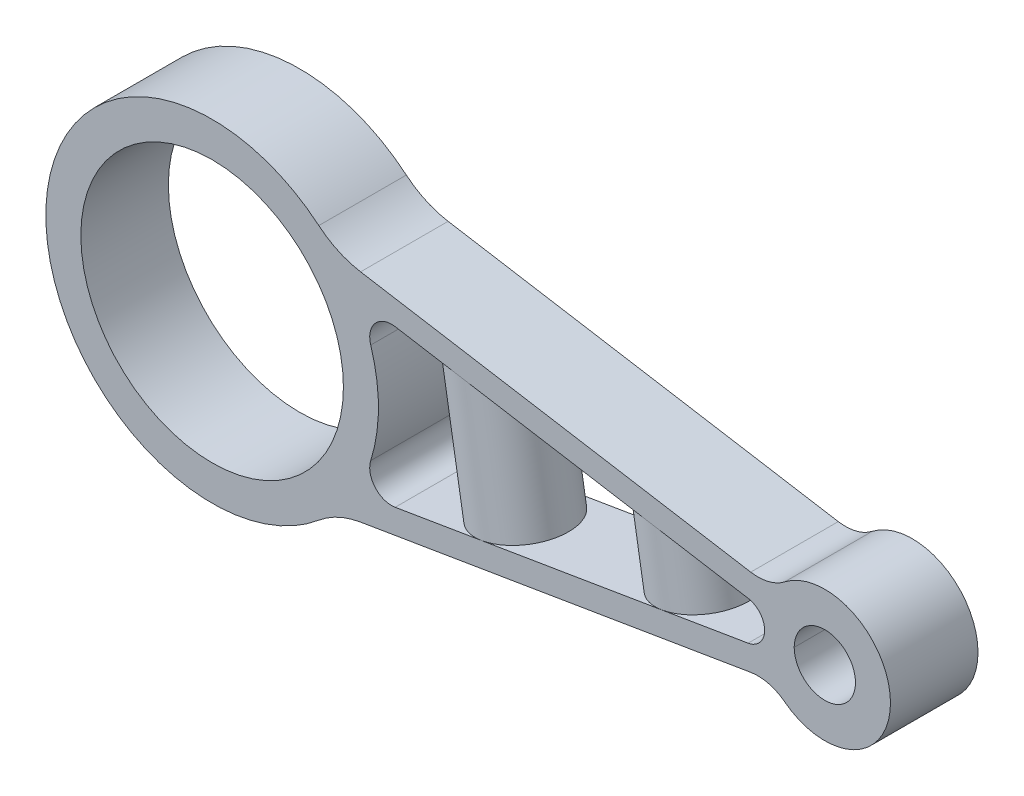
ISO-10303-21;
HEADER;
FILE_DESCRIPTION(('STEP AP214'),'2;1');
FILE_NAME('part.step','',(''),(''),'','','');
FILE_SCHEMA(('AUTOMOTIVE_DESIGN { 1 0 10303 214 1 1 1 1 }'));
ENDSEC;
DATA;
#1=APPLICATION_CONTEXT('core data for automotive mechanical design processes');
#2=APPLICATION_PROTOCOL_DEFINITION('international standard','automotive_design',2000,#1);
#3=PRODUCT_CONTEXT('',#1,'mechanical');
#4=PRODUCT('Part','Part','',(#3));
#5=PRODUCT_RELATED_PRODUCT_CATEGORY('part','',(#4));
#6=PRODUCT_DEFINITION_FORMATION('','',#4);
#7=PRODUCT_DEFINITION_CONTEXT('part definition',#1,'design');
#8=PRODUCT_DEFINITION('design','',#6,#7);
#9=PRODUCT_DEFINITION_SHAPE('','',#8);
#10=(LENGTH_UNIT() NAMED_UNIT(*) SI_UNIT(.MILLI.,.METRE.));
#11=(NAMED_UNIT(*) PLANE_ANGLE_UNIT() SI_UNIT($,.RADIAN.));
#12=(NAMED_UNIT(*) SI_UNIT($,.STERADIAN.) SOLID_ANGLE_UNIT());
#13=UNCERTAINTY_MEASURE_WITH_UNIT(LENGTH_MEASURE(1.E-05),#10,'distance_accuracy_value','');
#14=(GEOMETRIC_REPRESENTATION_CONTEXT(3) GLOBAL_UNCERTAINTY_ASSIGNED_CONTEXT((#13)) GLOBAL_UNIT_ASSIGNED_CONTEXT((#10,
#11,#12)) REPRESENTATION_CONTEXT('',''));
#15=CARTESIAN_POINT('',(0.,0.,0.));
#16=DIRECTION('',(0.,0.,1.));
#17=DIRECTION('',(1.,0.,0.));
#18=AXIS2_PLACEMENT_3D('',#15,#16,#17);
#19=CARTESIAN_POINT('',(-84.997742384033,17.8709827250915,-10.));
#20=DIRECTION('',(-0.164285714285714,-0.986412795984335,0.));
#21=DIRECTION('',(0.986412795984335,-0.164285714285714,0.));
#22=AXIS2_PLACEMENT_3D('',#19,#20,#21);
#23=PLANE('',#22);
#24=DIRECTION('',(0.986412795984335,-0.164285714285714,0.));
#25=VECTOR('',#24,1.);
#26=CARTESIAN_POINT('',(-84.997742384033,17.8709827250915,-10.));
#27=LINE('',#26,#25);
#28=CARTESIAN_POINT('',(-70.2664066732912,15.4174987278499,-10.));
#29=VERTEX_POINT('',#28);
#30=CARTESIAN_POINT('',(-26.7225788701046,8.16533322218845,-10.));
#31=VERTEX_POINT('',#30);
#32=EDGE_CURVE('E193',#29,#31,#27,.T.);
#33=ORIENTED_EDGE('',*,*,#32,.T.);
#34=CARTESIAN_POINT('',(-26.7225788701046,8.16533322218845,0.));
#35=DIRECTION('',(-0.164285714285714,-0.986412795984335,0.));
#36=DIRECTION('',(0.986412795984335,-0.164285714285714,0.));
#37=AXIS2_PLACEMENT_3D('',#34,#35,#36);
#38=ELLIPSE('',#37,10.5705964836587,10.);
#39=CARTESIAN_POINT('',(-26.7225788701046,8.16533322218845,10.));
#40=VERTEX_POINT('',#39);
#41=EDGE_CURVE('E57',#40,#31,#38,.T.);
#42=ORIENTED_EDGE('',*,*,#41,.F.);
#43=DIRECTION('',(0.986412795984335,-0.164285714285714,0.));
#44=VECTOR('',#43,1.);
#45=CARTESIAN_POINT('',(-84.997742384033,17.8709827250915,10.));
#46=LINE('',#45,#44);
#47=CARTESIAN_POINT('',(-70.2664066732912,15.4174987278499,10.));
#48=VERTEX_POINT('',#47);
#49=EDGE_CURVE('E190',#48,#40,#46,.T.);
#50=ORIENTED_EDGE('',*,*,#49,.F.);
#51=CARTESIAN_POINT('',(-70.2664066732912,15.4174987278499,0.));
#52=DIRECTION('',(-0.164285714285714,-0.986412795984335,0.));
#53=DIRECTION('',(0.986412795984335,-0.164285714285714,0.));
#54=AXIS2_PLACEMENT_3D('',#51,#52,#53);
#55=ELLIPSE('',#54,10.5705964836587,10.);
#56=EDGE_CURVE('E356',#29,#48,#55,.T.);
#57=ORIENTED_EDGE('',*,*,#56,.F.);
#58=EDGE_LOOP('',(#33,#42,#50,#57));
#59=FACE_BOUND('',#58,.T.);
#60=ADVANCED_FACE('F43',(#59),#23,.T.);
#61=CARTESIAN_POINT('',(-84.997742384033,-17.8709827250915,-10.));
#62=DIRECTION('',(0.164285714285714,-0.986412795984335,0.));
#63=DIRECTION('',(0.986412795984335,0.164285714285714,0.));
#64=AXIS2_PLACEMENT_3D('',#61,#62,#63);
#65=PLANE('',#64);
#66=CARTESIAN_POINT('',(-24.0761367129848,-7.72457186764381,0.));
#67=DIRECTION('',(0.164285714285714,-0.986412795984335,0.));
#68=DIRECTION('',(0.986412795984335,0.164285714285714,0.));
#69=AXIS2_PLACEMENT_3D('',#66,#67,#68);
#70=CIRCLE('',#69,10.);
#71=CARTESIAN_POINT('',(-24.0761367129848,-7.7245718676438,-10.));
#72=VERTEX_POINT('',#71);
#73=CARTESIAN_POINT('',(-24.0761367129848,-7.72457186764381,10.));
#74=VERTEX_POINT('',#73);
#75=EDGE_CURVE('E11',#72,#74,#70,.F.);
#76=ORIENTED_EDGE('',*,*,#75,.F.);
#77=DIRECTION('',(0.986412795984335,0.164285714285714,0.));
#78=VECTOR('',#77,1.);
#79=CARTESIAN_POINT('',(-84.997742384033,-17.8709827250915,-10.));
#80=LINE('',#79,#78);
#81=CARTESIAN_POINT('',(-65.2694864643464,-14.5852684393772,-10.));
#82=VERTEX_POINT('',#81);
#83=EDGE_CURVE('E343',#82,#72,#80,.T.);
#84=ORIENTED_EDGE('',*,*,#83,.F.);
#85=CARTESIAN_POINT('',(-65.2694864643464,-14.5852684393772,0.));
#86=DIRECTION('',(-0.164285714285714,0.986412795984335,0.));
#87=DIRECTION('',(-0.986412795984335,-0.164285714285714,0.));
#88=AXIS2_PLACEMENT_3D('',#85,#86,#87);
#89=CIRCLE('',#88,10.);
#90=CARTESIAN_POINT('',(-65.2694864643464,-14.5852684393772,10.));
#91=VERTEX_POINT('',#90);
#92=EDGE_CURVE('E311',#91,#82,#89,.T.);
#93=ORIENTED_EDGE('',*,*,#92,.F.);
#94=DIRECTION('',(0.986412795984335,0.164285714285714,0.));
#95=VECTOR('',#94,1.);
#96=CARTESIAN_POINT('',(-84.997742384033,-17.8709827250915,10.));
#97=LINE('',#96,#95);
#98=EDGE_CURVE('E323',#91,#74,#97,.T.);
#99=ORIENTED_EDGE('',*,*,#98,.T.);
#100=EDGE_LOOP('',(#76,#84,#93,#99));
#101=FACE_BOUND('',#100,.T.);
#102=ADVANCED_FACE('F372',(#101),#65,.F.);
#103=CARTESIAN_POINT('',(-84.997742384033,17.8709827250915,-10.));
#104=VERTEX_POINT('',#103);
#105=EDGE_CURVE('E226',#104,#29,#27,.T.);
#106=ORIENTED_EDGE('',*,*,#105,.T.);
#107=EDGE_CURVE('E354',#48,#29,#55,.T.);
#108=ORIENTED_EDGE('',*,*,#107,.F.);
#109=CARTESIAN_POINT('',(-84.997742384033,17.8709827250915,10.));
#110=VERTEX_POINT('',#109);
#111=EDGE_CURVE('E204',#110,#48,#46,.T.);
#112=ORIENTED_EDGE('',*,*,#111,.F.);
#113=DIRECTION('',(0.,0.,1.));
#114=VECTOR('',#113,1.);
#115=CARTESIAN_POINT('',(-84.997742384033,17.8709827250915,-10.));
#116=LINE('',#115,#114);
#117=EDGE_CURVE('E212',#104,#110,#116,.T.);
#118=ORIENTED_EDGE('',*,*,#117,.F.);
#119=EDGE_LOOP('',(#106,#108,#112,#118));
#120=FACE_BOUND('',#119,.T.);
#121=ADVANCED_FACE('F360',(#120),#23,.T.);
#122=CARTESIAN_POINT('',(-65.2694864643464,-14.5852684393772,0.));
#123=DIRECTION('',(0.164285714285714,-0.986412795984335,0.));
#124=DIRECTION('',(0.986412795984335,0.164285714285714,0.));
#125=AXIS2_PLACEMENT_3D('',#122,#123,#124);
#126=CIRCLE('',#125,10.);
#127=EDGE_CURVE('E51',#82,#91,#126,.F.);
#128=ORIENTED_EDGE('',*,*,#127,.F.);
#129=CARTESIAN_POINT('',(-84.997742384033,-17.8709827250915,-10.));
#130=VERTEX_POINT('',#129);
#131=EDGE_CURVE('E316',#130,#82,#80,.T.);
#132=ORIENTED_EDGE('',*,*,#131,.F.);
#133=DIRECTION('',(0.,0.,1.));
#134=VECTOR('',#133,1.);
#135=CARTESIAN_POINT('',(-84.997742384033,-17.8709827250915,-10.));
#136=LINE('',#135,#134);
#137=CARTESIAN_POINT('',(-84.997742384033,-17.8709827250915,10.));
#138=VERTEX_POINT('',#137);
#139=EDGE_CURVE('E219',#130,#138,#136,.T.);
#140=ORIENTED_EDGE('',*,*,#139,.T.);
#141=EDGE_CURVE('E319',#138,#91,#97,.T.);
#142=ORIENTED_EDGE('',*,*,#141,.T.);
#143=EDGE_LOOP('',(#128,#132,#140,#142));
#144=FACE_BOUND('',#143,.T.);
#145=ADVANCED_FACE('F315',(#144),#65,.F.);
#146=CARTESIAN_POINT('',(13.1737030576335,0.,10.));
#147=DIRECTION('',(0.,0.,-1.));
#148=DIRECTION('',(-1.,0.,0.));
#149=AXIS2_PLACEMENT_3D('',#146,#147,#148);
#150=CYLINDRICAL_SURFACE('',#149,7.00000000000001);
#151=CARTESIAN_POINT('',(13.1737030576335,0.,10.));
#152=DIRECTION('',(0.,0.,1.));
#153=DIRECTION('',(1.,0.,0.));
#154=AXIS2_PLACEMENT_3D('',#151,#152,#153);
#155=CIRCLE('',#154,7.00000000000001);
#156=CARTESIAN_POINT('',(6.17370305763348,0.,10.));
#157=VERTEX_POINT('',#156);
#158=CARTESIAN_POINT('',(20.1737030576335,0.,10.));
#159=VERTEX_POINT('',#158);
#160=EDGE_CURVE('E227',#157,#159,#155,.T.);
#161=ORIENTED_EDGE('',*,*,#160,.T.);
#162=DIRECTION('',(0.,0.,-1.));
#163=VECTOR('',#162,1.);
#164=CARTESIAN_POINT('',(20.1737030576335,0.,10.));
#165=LINE('',#164,#163);
#166=CARTESIAN_POINT('',(20.1737030576335,0.,-10.));
#167=VERTEX_POINT('',#166);
#168=EDGE_CURVE('E304',#159,#167,#165,.T.);
#169=ORIENTED_EDGE('',*,*,#168,.T.);
#170=CARTESIAN_POINT('',(13.1737030576335,0.,-10.));
#171=DIRECTION('',(0.,0.,1.));
#172=DIRECTION('',(1.,0.,0.));
#173=AXIS2_PLACEMENT_3D('',#170,#171,#172);
#174=CIRCLE('',#173,7.00000000000001);
#175=CARTESIAN_POINT('',(6.17370305763348,0.,-10.));
#176=VERTEX_POINT('',#175);
#177=EDGE_CURVE('E232',#176,#167,#174,.T.);
#178=ORIENTED_EDGE('',*,*,#177,.F.);
#179=DIRECTION('',(0.,0.,1.));
#180=VECTOR('',#179,1.);
#181=CARTESIAN_POINT('',(6.17370305763348,0.,10.));
#182=LINE('',#181,#180);
#183=EDGE_CURVE('E300',#176,#157,#182,.T.);
#184=ORIENTED_EDGE('',*,*,#183,.T.);
#185=EDGE_LOOP('',(#161,#169,#178,#184));
#186=FACE_BOUND('',#185,.T.);
#187=ADVANCED_FACE('F410',(#186),#150,.F.);
#188=CARTESIAN_POINT('',(-126.826296942367,0.,10.));
#189=DIRECTION('',(0.,0.,1.));
#190=DIRECTION('',(1.,0.,0.));
#191=AXIS2_PLACEMENT_3D('',#188,#189,#190);
#192=PLANE('',#191);
#193=ORIENTED_EDGE('',*,*,#160,.F.);
#194=EDGE_CURVE('E231',#159,#157,#155,.T.);
#195=ORIENTED_EDGE('',*,*,#194,.F.);
#196=EDGE_LOOP('',(#193,#195));
#197=FACE_BOUND('',#196,.T.);
#198=DIRECTION('',(0.986412795984335,0.164285714285714,0.));
#199=VECTOR('',#198,1.);
#200=CARTESIAN_POINT('',(1.23745852689178,-9.08438586269532,10.));
#201=LINE('',#200,#199);
#202=CARTESIAN_POINT('',(-92.9032292028307,-24.7633898151861,10.));
#203=VERTEX_POINT('',#202);
#204=CARTESIAN_POINT('',(-3.7575421586515,-9.91629645714704,10.));
#205=VERTEX_POINT('',#204);
#206=EDGE_CURVE('E244',#203,#205,#201,.T.);
#207=ORIENTED_EDGE('',*,*,#206,.T.);
#208=CARTESIAN_POINT('',(-2.11468501579436,-19.7804244169904,10.));
#209=DIRECTION('',(0.,0.,1.));
#210=DIRECTION('',(1.,0.,0.));
#211=AXIS2_PLACEMENT_3D('',#208,#209,#210);
#212=CIRCLE('',#211,10.);
#213=CARTESIAN_POINT('',(4.00067021357678,-11.8682546501942,10.));
#214=VERTEX_POINT('',#213);
#215=EDGE_CURVE('E298',#205,#214,#212,.F.);
#216=ORIENTED_EDGE('',*,*,#215,.T.);
#217=CARTESIAN_POINT('',(13.1737030576335,0.,10.));
#218=DIRECTION('',(0.,0.,1.));
#219=DIRECTION('',(1.,0.,0.));
#220=AXIS2_PLACEMENT_3D('',#217,#218,#219);
#221=CIRCLE('',#220,15.);
#222=CARTESIAN_POINT('',(4.00067021357679,11.8682546501942,10.));
#223=VERTEX_POINT('',#222);
#224=EDGE_CURVE('E248',#214,#223,#221,.T.);
#225=ORIENTED_EDGE('',*,*,#224,.T.);
#226=CARTESIAN_POINT('',(-2.11468501579435,19.7804244169904,10.));
#227=DIRECTION('',(0.,0.,1.));
#228=DIRECTION('',(1.,0.,0.));
#229=AXIS2_PLACEMENT_3D('',#226,#227,#228);
#230=CIRCLE('',#229,10.);
#231=CARTESIAN_POINT('',(-3.7575421586515,9.91629645714704,10.));
#232=VERTEX_POINT('',#231);
#233=EDGE_CURVE('E280',#223,#232,#230,.F.);
#234=ORIENTED_EDGE('',*,*,#233,.T.);
#235=DIRECTION('',(-0.986412795984335,0.164285714285714,0.));
#236=VECTOR('',#235,1.);
#237=CARTESIAN_POINT('',(-98.8908232664171,25.7606154914888,10.));
#238=LINE('',#237,#236);
#239=CARTESIAN_POINT('',(-92.9032292028307,24.7633898151861,10.));
#240=VERTEX_POINT('',#239);
#241=EDGE_CURVE('E250',#232,#240,#238,.T.);
#242=ORIENTED_EDGE('',*,*,#241,.T.);
#243=CARTESIAN_POINT('',(-89.6175149171164,44.4916457348728,10.));
#244=DIRECTION('',(0.,0.,1.));
#245=DIRECTION('',(1.,0.,0.));
#246=AXIS2_PLACEMENT_3D('',#243,#244,#245);
#247=CIRCLE('',#246,20.);
#248=CARTESIAN_POINT('',(-102.448129408582,29.1496989297442,10.));
#249=VERTEX_POINT('',#248);
#250=EDGE_CURVE('E269',#240,#249,#247,.F.);
#251=ORIENTED_EDGE('',*,*,#250,.T.);
#252=CARTESIAN_POINT('',(-126.826296942367,0.,10.));
#253=DIRECTION('',(0.,0.,1.));
#254=DIRECTION('',(1.,0.,0.));
#255=AXIS2_PLACEMENT_3D('',#252,#253,#254);
#256=CIRCLE('',#255,38.);
#257=CARTESIAN_POINT('',(-102.448129408582,-29.1496989297442,10.));
#258=VERTEX_POINT('',#257);
#259=EDGE_CURVE('E241',#249,#258,#256,.T.);
#260=ORIENTED_EDGE('',*,*,#259,.T.);
#261=CARTESIAN_POINT('',(-89.6175149171164,-44.4916457348728,10.));
#262=DIRECTION('',(0.,0.,1.));
#263=DIRECTION('',(1.,0.,0.));
#264=AXIS2_PLACEMENT_3D('',#261,#262,#263);
#265=CIRCLE('',#264,20.);
#266=EDGE_CURVE('E289',#258,#203,#265,.F.);
#267=ORIENTED_EDGE('',*,*,#266,.T.);
#268=EDGE_LOOP('',(#207,#216,#225,#234,#242,#251,#260,#267));
#269=FACE_BOUND('',#268,.T.);
#270=CARTESIAN_POINT('',(-126.826296942367,0.,10.));
#271=DIRECTION('',(0.,0.,1.));
#272=DIRECTION('',(1.,0.,0.));
#273=AXIS2_PLACEMENT_3D('',#270,#271,#272);
#274=CIRCLE('',#273,30.);
#275=CARTESIAN_POINT('',(-96.8262969423665,0.,10.));
#276=VERTEX_POINT('',#275);
#277=EDGE_CURVE('E235',#276,#276,#274,.T.);
#278=ORIENTED_EDGE('',*,*,#277,.F.);
#279=EDGE_LOOP('',(#278));
#280=FACE_BOUND('',#279,.T.);
#281=CARTESIAN_POINT('',(-85.8191709554616,12.9389187451698,10.));
#282=DIRECTION('',(0.,0.,1.));
#283=DIRECTION('',(1.,0.,0.));
#284=AXIS2_PLACEMENT_3D('',#281,#282,#283);
#285=CIRCLE('',#284,4.99999999999999);
#286=CARTESIAN_POINT('',(-90.5874414190552,11.4343933096849,10.));
#287=VERTEX_POINT('',#286);
#288=EDGE_CURVE('E332',#110,#287,#285,.T.);
#289=ORIENTED_EDGE('',*,*,#288,.F.);
#290=ORIENTED_EDGE('',*,*,#111,.T.);
#291=ORIENTED_EDGE('',*,*,#49,.T.);
#292=CARTESIAN_POINT('',(-4.34788079329814,4.43885758192951,10.));
#293=VERTEX_POINT('',#292);
#294=EDGE_CURVE('E195',#40,#293,#46,.T.);
#295=ORIENTED_EDGE('',*,*,#294,.T.);
#296=CARTESIAN_POINT('',(-5.08716650758385,0.,10.));
#297=DIRECTION('',(0.,0.,-1.));
#298=DIRECTION('',(-1.,0.,0.));
#299=AXIS2_PLACEMENT_3D('',#296,#297,#298);
#300=CIRCLE('',#299,4.5);
#301=CARTESIAN_POINT('',(-4.34788079329813,-4.43885758192951,10.));
#302=VERTEX_POINT('',#301);
#303=EDGE_CURVE('E202',#293,#302,#300,.T.);
#304=ORIENTED_EDGE('',*,*,#303,.T.);
#305=EDGE_CURVE('E324',#74,#302,#97,.T.);
#306=ORIENTED_EDGE('',*,*,#305,.F.);
#307=ORIENTED_EDGE('',*,*,#98,.F.);
#308=ORIENTED_EDGE('',*,*,#141,.F.);
#309=CARTESIAN_POINT('',(-85.8191709554616,-12.9389187451698,10.));
#310=DIRECTION('',(0.,0.,-1.));
#311=DIRECTION('',(-1.,0.,0.));
#312=AXIS2_PLACEMENT_3D('',#309,#310,#311);
#313=CIRCLE('',#312,4.99999999999999);
#314=CARTESIAN_POINT('',(-90.5874414190552,-11.4343933096849,10.));
#315=VERTEX_POINT('',#314);
#316=EDGE_CURVE('E327',#138,#315,#313,.T.);
#317=ORIENTED_EDGE('',*,*,#316,.T.);
#318=CARTESIAN_POINT('',(-126.826296942367,0.,10.));
#319=DIRECTION('',(0.,0.,-1.));
#320=DIRECTION('',(-1.,0.,0.));
#321=AXIS2_PLACEMENT_3D('',#318,#319,#320);
#322=CIRCLE('',#321,38.);
#323=EDGE_CURVE('E329',#287,#315,#322,.T.);
#324=ORIENTED_EDGE('',*,*,#323,.F.);
#325=EDGE_LOOP('',(#289,#290,#291,#295,#304,#306,#307,#308,#317,#324));
#326=FACE_BOUND('',#325,.T.);
#327=ADVANCED_FACE('F206',(#197,#269,#280,#326),#192,.T.);
#328=CARTESIAN_POINT('',(-126.826296942367,0.,-10.));
#329=DIRECTION('',(0.,0.,1.));
#330=DIRECTION('',(1.,0.,0.));
#331=AXIS2_PLACEMENT_3D('',#328,#329,#330);
#332=PLANE('',#331);
#333=CARTESIAN_POINT('',(-126.826296942367,0.,-10.));
#334=DIRECTION('',(0.,0.,1.));
#335=DIRECTION('',(1.,0.,0.));
#336=AXIS2_PLACEMENT_3D('',#333,#334,#335);
#337=CIRCLE('',#336,38.);
#338=CARTESIAN_POINT('',(-102.448129408582,29.1496989297442,-10.));
#339=VERTEX_POINT('',#338);
#340=CARTESIAN_POINT('',(-102.448129408582,-29.1496989297442,-10.));
#341=VERTEX_POINT('',#340);
#342=EDGE_CURVE('E238',#339,#341,#337,.T.);
#343=ORIENTED_EDGE('',*,*,#342,.F.);
#344=CARTESIAN_POINT('',(-89.6175149171164,44.4916457348728,-10.));
#345=DIRECTION('',(0.,0.,1.));
#346=DIRECTION('',(1.,0.,0.));
#347=AXIS2_PLACEMENT_3D('',#344,#345,#346);
#348=CIRCLE('',#347,20.);
#349=CARTESIAN_POINT('',(-92.9032292028307,24.7633898151861,-10.));
#350=VERTEX_POINT('',#349);
#351=EDGE_CURVE('E266',#339,#350,#348,.T.);
#352=ORIENTED_EDGE('',*,*,#351,.T.);
#353=DIRECTION('',(-0.986412795984335,0.164285714285714,0.));
#354=VECTOR('',#353,1.);
#355=CARTESIAN_POINT('',(-98.8908232664171,25.7606154914888,-10.));
#356=LINE('',#355,#354);
#357=CARTESIAN_POINT('',(-3.7575421586515,9.91629645714704,-10.));
#358=VERTEX_POINT('',#357);
#359=EDGE_CURVE('E245',#358,#350,#356,.T.);
#360=ORIENTED_EDGE('',*,*,#359,.F.);
#361=CARTESIAN_POINT('',(-2.11468501579435,19.7804244169904,-10.));
#362=DIRECTION('',(0.,0.,1.));
#363=DIRECTION('',(1.,0.,0.));
#364=AXIS2_PLACEMENT_3D('',#361,#362,#363);
#365=CIRCLE('',#364,10.);
#366=CARTESIAN_POINT('',(4.00067021357679,11.8682546501942,-10.));
#367=VERTEX_POINT('',#366);
#368=EDGE_CURVE('E277',#358,#367,#365,.T.);
#369=ORIENTED_EDGE('',*,*,#368,.T.);
#370=CARTESIAN_POINT('',(13.1737030576335,0.,-10.));
#371=DIRECTION('',(0.,0.,1.));
#372=DIRECTION('',(1.,0.,0.));
#373=AXIS2_PLACEMENT_3D('',#370,#371,#372);
#374=CIRCLE('',#373,15.);
#375=CARTESIAN_POINT('',(4.00067021357678,-11.8682546501942,-10.));
#376=VERTEX_POINT('',#375);
#377=EDGE_CURVE('E258',#376,#367,#374,.T.);
#378=ORIENTED_EDGE('',*,*,#377,.F.);
#379=CARTESIAN_POINT('',(-2.11468501579436,-19.7804244169904,-10.));
#380=DIRECTION('',(0.,0.,1.));
#381=DIRECTION('',(1.,0.,0.));
#382=AXIS2_PLACEMENT_3D('',#379,#380,#381);
#383=CIRCLE('',#382,10.);
#384=CARTESIAN_POINT('',(-3.7575421586515,-9.91629645714704,-10.));
#385=VERTEX_POINT('',#384);
#386=EDGE_CURVE('E296',#376,#385,#383,.T.);
#387=ORIENTED_EDGE('',*,*,#386,.T.);
#388=DIRECTION('',(0.986412795984335,0.164285714285714,0.));
#389=VECTOR('',#388,1.);
#390=CARTESIAN_POINT('',(1.23745852689178,-9.08438586269532,-10.));
#391=LINE('',#390,#389);
#392=CARTESIAN_POINT('',(-92.9032292028307,-24.7633898151861,-10.));
#393=VERTEX_POINT('',#392);
#394=EDGE_CURVE('E255',#393,#385,#391,.T.);
#395=ORIENTED_EDGE('',*,*,#394,.F.);
#396=CARTESIAN_POINT('',(-89.6175149171164,-44.4916457348728,-10.));
#397=DIRECTION('',(0.,0.,1.));
#398=DIRECTION('',(1.,0.,0.));
#399=AXIS2_PLACEMENT_3D('',#396,#397,#398);
#400=CIRCLE('',#399,20.);
#401=EDGE_CURVE('E287',#393,#341,#400,.T.);
#402=ORIENTED_EDGE('',*,*,#401,.T.);
#403=EDGE_LOOP('',(#343,#352,#360,#369,#378,#387,#395,#402));
#404=FACE_BOUND('',#403,.T.);
#405=CARTESIAN_POINT('',(-126.826296942367,0.,-10.));
#406=DIRECTION('',(0.,0.,1.));
#407=DIRECTION('',(1.,0.,0.));
#408=AXIS2_PLACEMENT_3D('',#405,#406,#407);
#409=CIRCLE('',#408,30.);
#410=CARTESIAN_POINT('',(-96.8262969423665,0.,-10.));
#411=VERTEX_POINT('',#410);
#412=EDGE_CURVE('E230',#411,#411,#409,.T.);
#413=ORIENTED_EDGE('',*,*,#412,.T.);
#414=EDGE_LOOP('',(#413));
#415=FACE_BOUND('',#414,.T.);
#416=ORIENTED_EDGE('',*,*,#177,.T.);
#417=EDGE_CURVE('E214',#167,#176,#174,.T.);
#418=ORIENTED_EDGE('',*,*,#417,.T.);
#419=EDGE_LOOP('',(#416,#418));
#420=FACE_BOUND('',#419,.T.);
#421=ORIENTED_EDGE('',*,*,#105,.F.);
#422=CARTESIAN_POINT('',(-85.8191709554616,12.9389187451698,-10.));
#423=DIRECTION('',(0.,0.,1.));
#424=DIRECTION('',(1.,0.,0.));
#425=AXIS2_PLACEMENT_3D('',#422,#423,#424);
#426=CIRCLE('',#425,4.99999999999999);
#427=CARTESIAN_POINT('',(-90.5874414190552,11.4343933096849,-10.));
#428=VERTEX_POINT('',#427);
#429=EDGE_CURVE('E208',#104,#428,#426,.T.);
#430=ORIENTED_EDGE('',*,*,#429,.T.);
#431=CARTESIAN_POINT('',(-126.826296942367,0.,-10.));
#432=DIRECTION('',(0.,0.,-1.));
#433=DIRECTION('',(-1.,0.,0.));
#434=AXIS2_PLACEMENT_3D('',#431,#432,#433);
#435=CIRCLE('',#434,38.);
#436=CARTESIAN_POINT('',(-90.5874414190552,-11.4343933096849,-10.));
#437=VERTEX_POINT('',#436);
#438=EDGE_CURVE('E348',#428,#437,#435,.T.);
#439=ORIENTED_EDGE('',*,*,#438,.T.);
#440=CARTESIAN_POINT('',(-85.8191709554616,-12.9389187451698,-10.));
#441=DIRECTION('',(0.,0.,-1.));
#442=DIRECTION('',(-1.,0.,0.));
#443=AXIS2_PLACEMENT_3D('',#440,#441,#442);
#444=CIRCLE('',#443,4.99999999999999);
#445=EDGE_CURVE('E345',#130,#437,#444,.T.);
#446=ORIENTED_EDGE('',*,*,#445,.F.);
#447=ORIENTED_EDGE('',*,*,#131,.T.);
#448=ORIENTED_EDGE('',*,*,#83,.T.);
#449=CARTESIAN_POINT('',(-4.34788079329813,-4.43885758192951,-10.));
#450=VERTEX_POINT('',#449);
#451=EDGE_CURVE('E344',#72,#450,#80,.T.);
#452=ORIENTED_EDGE('',*,*,#451,.T.);
#453=CARTESIAN_POINT('',(-5.08716650758385,0.,-10.));
#454=DIRECTION('',(0.,0.,-1.));
#455=DIRECTION('',(-1.,0.,0.));
#456=AXIS2_PLACEMENT_3D('',#453,#454,#455);
#457=CIRCLE('',#456,4.5);
#458=CARTESIAN_POINT('',(-4.34788079329814,4.43885758192951,-10.));
#459=VERTEX_POINT('',#458);
#460=EDGE_CURVE('E339',#459,#450,#457,.T.);
#461=ORIENTED_EDGE('',*,*,#460,.F.);
#462=EDGE_CURVE('E338',#31,#459,#27,.T.);
#463=ORIENTED_EDGE('',*,*,#462,.F.);
#464=ORIENTED_EDGE('',*,*,#32,.F.);
#465=EDGE_LOOP('',(#421,#430,#439,#446,#447,#448,#452,#461,#463,#464));
#466=FACE_BOUND('',#465,.T.);
#467=ADVANCED_FACE('F364',(#404,#415,#420,#466),#332,.F.);
#468=CARTESIAN_POINT('',(-126.826296942367,0.,10.));
#469=DIRECTION('',(0.,0.,-1.));
#470=DIRECTION('',(-1.,0.,0.));
#471=AXIS2_PLACEMENT_3D('',#468,#469,#470);
#472=CYLINDRICAL_SURFACE('',#471,38.);
#473=ORIENTED_EDGE('',*,*,#342,.T.);
#474=DIRECTION('',(0.,0.,-1.));
#475=VECTOR('',#474,1.);
#476=CARTESIAN_POINT('',(-102.448129408582,-29.1496989297442,10.));
#477=LINE('',#476,#475);
#478=EDGE_CURVE('E285',#341,#258,#477,.F.);
#479=ORIENTED_EDGE('',*,*,#478,.T.);
#480=ORIENTED_EDGE('',*,*,#259,.F.);
#481=DIRECTION('',(0.,0.,-1.));
#482=VECTOR('',#481,1.);
#483=CARTESIAN_POINT('',(-102.448129408582,29.1496989297442,10.));
#484=LINE('',#483,#482);
#485=EDGE_CURVE('E252',#249,#339,#484,.T.);
#486=ORIENTED_EDGE('',*,*,#485,.T.);
#487=EDGE_LOOP('',(#473,#479,#480,#486));
#488=FACE_BOUND('',#487,.T.);
#489=ADVANCED_FACE('F420',(#488),#472,.T.);
#490=CARTESIAN_POINT('',(1.23745852689178,-9.08438586269532,10.));
#491=DIRECTION('',(-0.164285714285714,0.986412795984335,0.));
#492=DIRECTION('',(-0.986412795984335,-0.164285714285714,0.));
#493=AXIS2_PLACEMENT_3D('',#490,#491,#492);
#494=PLANE('',#493);
#495=ORIENTED_EDGE('',*,*,#394,.T.);
#496=DIRECTION('',(0.,0.,1.));
#497=VECTOR('',#496,1.);
#498=CARTESIAN_POINT('',(-3.7575421586515,-9.91629645714704,10.));
#499=LINE('',#498,#497);
#500=EDGE_CURVE('E294',#385,#205,#499,.T.);
#501=ORIENTED_EDGE('',*,*,#500,.T.);
#502=ORIENTED_EDGE('',*,*,#206,.F.);
#503=DIRECTION('',(0.,0.,1.));
#504=VECTOR('',#503,1.);
#505=CARTESIAN_POINT('',(-92.9032292028307,-24.7633898151861,-10.));
#506=LINE('',#505,#504);
#507=EDGE_CURVE('E282',#203,#393,#506,.F.);
#508=ORIENTED_EDGE('',*,*,#507,.T.);
#509=EDGE_LOOP('',(#495,#501,#502,#508));
#510=FACE_BOUND('',#509,.T.);
#511=ADVANCED_FACE('F428',(#510),#494,.F.);
#512=CARTESIAN_POINT('',(13.1737030576335,0.,10.));
#513=DIRECTION('',(0.,0.,-1.));
#514=DIRECTION('',(-1.,0.,0.));
#515=AXIS2_PLACEMENT_3D('',#512,#513,#514);
#516=CYLINDRICAL_SURFACE('',#515,15.);
#517=ORIENTED_EDGE('',*,*,#224,.F.);
#518=DIRECTION('',(0.,0.,-1.));
#519=VECTOR('',#518,1.);
#520=CARTESIAN_POINT('',(4.00067021357678,-11.8682546501942,10.));
#521=LINE('',#520,#519);
#522=EDGE_CURVE('E291',#214,#376,#521,.T.);
#523=ORIENTED_EDGE('',*,*,#522,.T.);
#524=ORIENTED_EDGE('',*,*,#377,.T.);
#525=DIRECTION('',(0.,0.,-1.));
#526=VECTOR('',#525,1.);
#527=CARTESIAN_POINT('',(4.00067021357679,11.8682546501942,10.));
#528=LINE('',#527,#526);
#529=EDGE_CURVE('E274',#367,#223,#528,.F.);
#530=ORIENTED_EDGE('',*,*,#529,.T.);
#531=EDGE_LOOP('',(#517,#523,#524,#530));
#532=FACE_BOUND('',#531,.T.);
#533=ADVANCED_FACE('F424',(#532),#516,.T.);
#534=CARTESIAN_POINT('',(-98.8908232664171,25.7606154914888,10.));
#535=DIRECTION('',(-0.164285714285714,-0.986412795984335,0.));
#536=DIRECTION('',(0.986412795984335,-0.164285714285714,0.));
#537=AXIS2_PLACEMENT_3D('',#534,#535,#536);
#538=PLANE('',#537);
#539=ORIENTED_EDGE('',*,*,#241,.F.);
#540=DIRECTION('',(0.,0.,1.));
#541=VECTOR('',#540,1.);
#542=CARTESIAN_POINT('',(-3.75754215865149,9.91629645714704,-10.));
#543=LINE('',#542,#541);
#544=EDGE_CURVE('E271',#232,#358,#543,.F.);
#545=ORIENTED_EDGE('',*,*,#544,.T.);
#546=ORIENTED_EDGE('',*,*,#359,.T.);
#547=DIRECTION('',(0.,0.,1.));
#548=VECTOR('',#547,1.);
#549=CARTESIAN_POINT('',(-92.9032292028307,24.7633898151861,10.));
#550=LINE('',#549,#548);
#551=EDGE_CURVE('E263',#350,#240,#550,.T.);
#552=ORIENTED_EDGE('',*,*,#551,.T.);
#553=EDGE_LOOP('',(#539,#545,#546,#552));
#554=FACE_BOUND('',#553,.T.);
#555=ADVANCED_FACE('F413',(#554),#538,.F.);
#556=CARTESIAN_POINT('',(-126.826296942367,0.,10.));
#557=DIRECTION('',(0.,0.,-1.));
#558=DIRECTION('',(-1.,0.,0.));
#559=AXIS2_PLACEMENT_3D('',#556,#557,#558);
#560=CYLINDRICAL_SURFACE('',#559,30.);
#561=ORIENTED_EDGE('',*,*,#277,.T.);
#562=EDGE_LOOP('',(#561));
#563=FACE_BOUND('',#562,.T.);
#564=ORIENTED_EDGE('',*,*,#412,.F.);
#565=EDGE_LOOP('',(#564));
#566=FACE_BOUND('',#565,.T.);
#567=ADVANCED_FACE('F408',(#563,#566),#560,.F.);
#568=ORIENTED_EDGE('',*,*,#168,.F.);
#569=ORIENTED_EDGE('',*,*,#194,.T.);
#570=ORIENTED_EDGE('',*,*,#183,.F.);
#571=ORIENTED_EDGE('',*,*,#417,.F.);
#572=EDGE_LOOP('',(#568,#569,#570,#571));
#573=FACE_BOUND('',#572,.T.);
#574=ADVANCED_FACE('F404',(#573),#150,.F.);
#575=CARTESIAN_POINT('',(-89.6175149171164,44.4916457348728,10.));
#576=DIRECTION('',(0.,0.,-1.));
#577=DIRECTION('',(-1.,0.,0.));
#578=AXIS2_PLACEMENT_3D('',#575,#576,#577);
#579=CYLINDRICAL_SURFACE('',#578,20.);
#580=ORIENTED_EDGE('',*,*,#250,.F.);
#581=ORIENTED_EDGE('',*,*,#551,.F.);
#582=ORIENTED_EDGE('',*,*,#351,.F.);
#583=ORIENTED_EDGE('',*,*,#485,.F.);
#584=EDGE_LOOP('',(#580,#581,#582,#583));
#585=FACE_BOUND('',#584,.T.);
#586=ADVANCED_FACE('F407',(#585),#579,.F.);
#587=CARTESIAN_POINT('',(-2.11468501579435,19.7804244169904,10.));
#588=DIRECTION('',(0.,0.,-1.));
#589=DIRECTION('',(-1.,0.,0.));
#590=AXIS2_PLACEMENT_3D('',#587,#588,#589);
#591=CYLINDRICAL_SURFACE('',#590,10.);
#592=ORIENTED_EDGE('',*,*,#233,.F.);
#593=ORIENTED_EDGE('',*,*,#529,.F.);
#594=ORIENTED_EDGE('',*,*,#368,.F.);
#595=ORIENTED_EDGE('',*,*,#544,.F.);
#596=EDGE_LOOP('',(#592,#593,#594,#595));
#597=FACE_BOUND('',#596,.T.);
#598=ADVANCED_FACE('F438',(#597),#591,.F.);
#599=CARTESIAN_POINT('',(-89.6175149171164,-44.4916457348728,10.));
#600=DIRECTION('',(0.,0.,-1.));
#601=DIRECTION('',(-1.,0.,0.));
#602=AXIS2_PLACEMENT_3D('',#599,#600,#601);
#603=CYLINDRICAL_SURFACE('',#602,20.);
#604=ORIENTED_EDGE('',*,*,#266,.F.);
#605=ORIENTED_EDGE('',*,*,#478,.F.);
#606=ORIENTED_EDGE('',*,*,#401,.F.);
#607=ORIENTED_EDGE('',*,*,#507,.F.);
#608=EDGE_LOOP('',(#604,#605,#606,#607));
#609=FACE_BOUND('',#608,.T.);
#610=ADVANCED_FACE('F399',(#609),#603,.F.);
#611=CARTESIAN_POINT('',(-2.11468501579436,-19.7804244169904,10.));
#612=DIRECTION('',(0.,0.,-1.));
#613=DIRECTION('',(-1.,0.,0.));
#614=AXIS2_PLACEMENT_3D('',#611,#612,#613);
#615=CYLINDRICAL_SURFACE('',#614,10.);
#616=ORIENTED_EDGE('',*,*,#215,.F.);
#617=ORIENTED_EDGE('',*,*,#500,.F.);
#618=ORIENTED_EDGE('',*,*,#386,.F.);
#619=ORIENTED_EDGE('',*,*,#522,.F.);
#620=EDGE_LOOP('',(#616,#617,#618,#619));
#621=FACE_BOUND('',#620,.T.);
#622=ADVANCED_FACE('F45',(#621),#615,.F.);
#623=CARTESIAN_POINT('',(-85.8191709554616,12.9389187451698,-10.));
#624=DIRECTION('',(0.,0.,1.));
#625=DIRECTION('',(1.,0.,0.));
#626=AXIS2_PLACEMENT_3D('',#623,#624,#625);
#627=CYLINDRICAL_SURFACE('',#626,4.99999999999999);
#628=ORIENTED_EDGE('',*,*,#288,.T.);
#629=DIRECTION('',(0.,0.,1.));
#630=VECTOR('',#629,1.);
#631=CARTESIAN_POINT('',(-90.5874414190552,11.4343933096849,-10.));
#632=LINE('',#631,#630);
#633=EDGE_CURVE('E223',#428,#287,#632,.T.);
#634=ORIENTED_EDGE('',*,*,#633,.F.);
#635=ORIENTED_EDGE('',*,*,#429,.F.);
#636=ORIENTED_EDGE('',*,*,#117,.T.);
#637=EDGE_LOOP('',(#628,#634,#635,#636));
#638=FACE_BOUND('',#637,.T.);
#639=ADVANCED_FACE('F389',(#638),#627,.F.);
#640=ORIENTED_EDGE('',*,*,#294,.F.);
#641=EDGE_CURVE('E178',#31,#40,#38,.T.);
#642=ORIENTED_EDGE('',*,*,#641,.F.);
#643=ORIENTED_EDGE('',*,*,#462,.T.);
#644=DIRECTION('',(0.,0.,1.));
#645=VECTOR('',#644,1.);
#646=CARTESIAN_POINT('',(-4.34788079329814,4.43885758192951,-10.));
#647=LINE('',#646,#645);
#648=EDGE_CURVE('E198',#459,#293,#647,.T.);
#649=ORIENTED_EDGE('',*,*,#648,.T.);
#650=EDGE_LOOP('',(#640,#642,#643,#649));
#651=FACE_BOUND('',#650,.T.);
#652=ADVANCED_FACE('F196',(#651),#23,.T.);
#653=CARTESIAN_POINT('',(-5.08716650758385,0.,-10.));
#654=DIRECTION('',(0.,0.,1.));
#655=DIRECTION('',(1.,0.,0.));
#656=AXIS2_PLACEMENT_3D('',#653,#654,#655);
#657=CYLINDRICAL_SURFACE('',#656,4.5);
#658=ORIENTED_EDGE('',*,*,#303,.F.);
#659=ORIENTED_EDGE('',*,*,#648,.F.);
#660=ORIENTED_EDGE('',*,*,#460,.T.);
#661=DIRECTION('',(0.,0.,1.));
#662=VECTOR('',#661,1.);
#663=CARTESIAN_POINT('',(-4.34788079329813,-4.43885758192951,-10.));
#664=LINE('',#663,#662);
#665=EDGE_CURVE('E216',#450,#302,#664,.T.);
#666=ORIENTED_EDGE('',*,*,#665,.T.);
#667=EDGE_LOOP('',(#658,#659,#660,#666));
#668=FACE_BOUND('',#667,.T.);
#669=ADVANCED_FACE('F367',(#668),#657,.F.);
#670=CARTESIAN_POINT('',(-24.0761367129848,-7.7245718676438,0.));
#671=DIRECTION('',(-0.164285714285714,0.986412795984335,0.));
#672=DIRECTION('',(-0.986412795984335,-0.164285714285714,0.));
#673=AXIS2_PLACEMENT_3D('',#670,#671,#672);
#674=CIRCLE('',#673,10.);
#675=EDGE_CURVE('E65',#74,#72,#674,.T.);
#676=ORIENTED_EDGE('',*,*,#675,.F.);
#677=ORIENTED_EDGE('',*,*,#305,.T.);
#678=ORIENTED_EDGE('',*,*,#665,.F.);
#679=ORIENTED_EDGE('',*,*,#451,.F.);
#680=EDGE_LOOP('',(#676,#677,#678,#679));
#681=FACE_BOUND('',#680,.T.);
#682=ADVANCED_FACE('F370',(#681),#65,.F.);
#683=CARTESIAN_POINT('',(-85.8191709554616,-12.9389187451698,-10.));
#684=DIRECTION('',(0.,0.,1.));
#685=DIRECTION('',(1.,0.,0.));
#686=AXIS2_PLACEMENT_3D('',#683,#684,#685);
#687=CYLINDRICAL_SURFACE('',#686,4.99999999999999);
#688=ORIENTED_EDGE('',*,*,#316,.F.);
#689=ORIENTED_EDGE('',*,*,#139,.F.);
#690=ORIENTED_EDGE('',*,*,#445,.T.);
#691=DIRECTION('',(0.,0.,1.));
#692=VECTOR('',#691,1.);
#693=CARTESIAN_POINT('',(-90.5874414190552,-11.4343933096849,-10.));
#694=LINE('',#693,#692);
#695=EDGE_CURVE('E221',#437,#315,#694,.T.);
#696=ORIENTED_EDGE('',*,*,#695,.T.);
#697=EDGE_LOOP('',(#688,#689,#690,#696));
#698=FACE_BOUND('',#697,.T.);
#699=ADVANCED_FACE('F484',(#698),#687,.F.);
#700=CARTESIAN_POINT('',(-126.826296942367,0.,-10.));
#701=DIRECTION('',(0.,0.,1.));
#702=DIRECTION('',(1.,0.,0.));
#703=AXIS2_PLACEMENT_3D('',#700,#701,#702);
#704=CYLINDRICAL_SURFACE('',#703,38.);
#705=ORIENTED_EDGE('',*,*,#323,.T.);
#706=ORIENTED_EDGE('',*,*,#695,.F.);
#707=ORIENTED_EDGE('',*,*,#438,.F.);
#708=ORIENTED_EDGE('',*,*,#633,.T.);
#709=EDGE_LOOP('',(#705,#706,#707,#708));
#710=FACE_BOUND('',#709,.T.);
#711=ADVANCED_FACE('F378',(#710),#704,.T.);
#712=CARTESIAN_POINT('',(-75.5376721786321,47.0675041352357,0.));
#713=DIRECTION('',(0.164285714285714,-0.986412795984335,0.));
#714=DIRECTION('',(0.986412795984335,0.164285714285714,0.));
#715=AXIS2_PLACEMENT_3D('',#712,#713,#714);
#716=CYLINDRICAL_SURFACE('',#715,10.);
#717=ORIENTED_EDGE('',*,*,#107,.T.);
#718=ORIENTED_EDGE('',*,*,#56,.T.);
#719=EDGE_LOOP('',(#717,#718));
#720=FACE_BOUND('',#719,.T.);
#721=ORIENTED_EDGE('',*,*,#92,.T.);
#722=ORIENTED_EDGE('',*,*,#127,.T.);
#723=EDGE_LOOP('',(#721,#722));
#724=FACE_BOUND('',#723,.T.);
#725=ADVANCED_FACE('F310',(#720,#724),#716,.T.);
#726=CARTESIAN_POINT('',(-34.3443224272705,53.9282007069691,0.));
#727=DIRECTION('',(0.164285714285714,-0.986412795984335,0.));
#728=DIRECTION('',(0.986412795984335,0.164285714285714,0.));
#729=AXIS2_PLACEMENT_3D('',#726,#727,#728);
#730=CYLINDRICAL_SURFACE('',#729,10.);
#731=ORIENTED_EDGE('',*,*,#41,.T.);
#732=ORIENTED_EDGE('',*,*,#641,.T.);
#733=EDGE_LOOP('',(#731,#732));
#734=FACE_BOUND('',#733,.T.);
#735=ORIENTED_EDGE('',*,*,#675,.T.);
#736=ORIENTED_EDGE('',*,*,#75,.T.);
#737=EDGE_LOOP('',(#735,#736));
#738=FACE_BOUND('',#737,.T.);
#739=ADVANCED_FACE('F179',(#734,#738),#730,.T.);
#740=CLOSED_SHELL('',(#60,#102,#121,#145,#187,#327,#467,#489,#511,#533,#555,#567,#574,#586,#598,
#610,#622,#639,#652,#669,#682,#699,#711,#725,#739));
#741=MANIFOLD_SOLID_BREP('B2',#740);
#742=ADVANCED_BREP_SHAPE_REPRESENTATION('',(#18,#741),#14);
#743=SHAPE_DEFINITION_REPRESENTATION(#9,#742);
ENDSEC;
END-ISO-10303-21;
